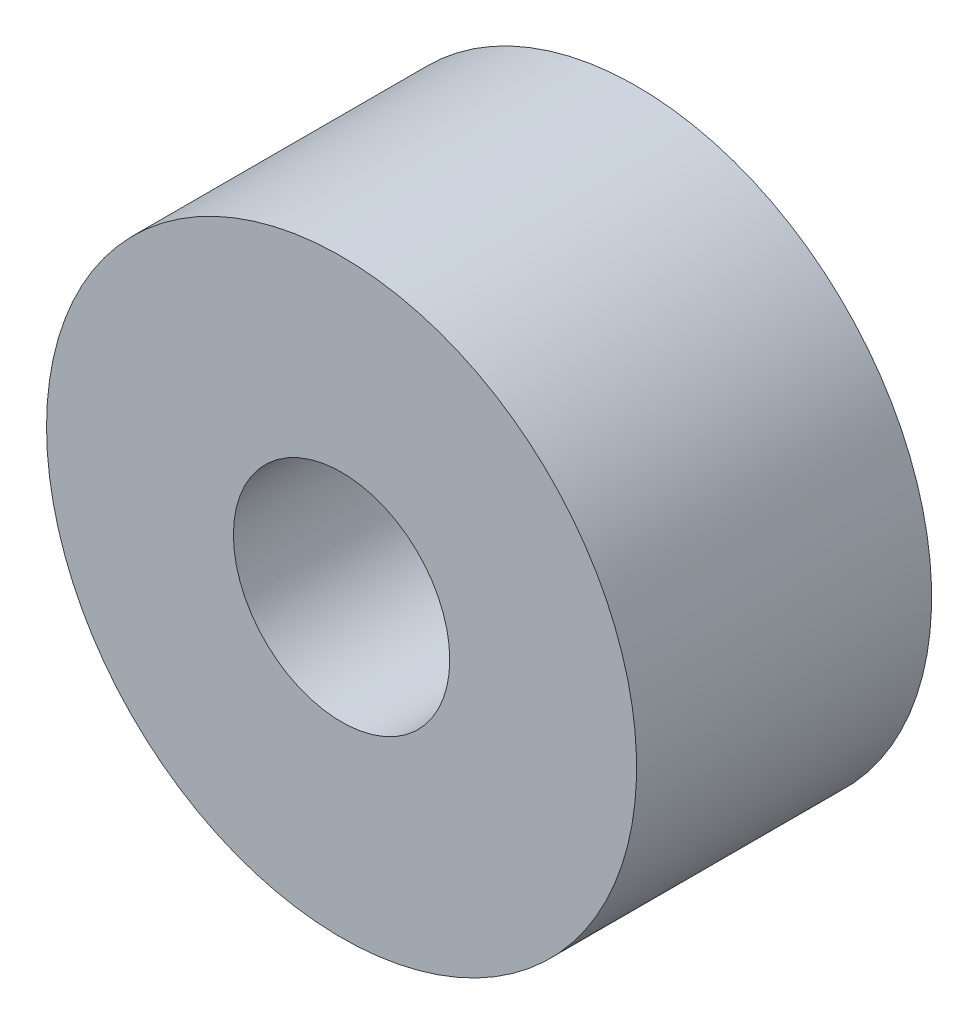
ISO-10303-21;
HEADER;
FILE_DESCRIPTION(('STEP AP214'),'2;1');
FILE_NAME('part.step','',(''),(''),'','','');
FILE_SCHEMA(('AUTOMOTIVE_DESIGN { 1 0 10303 214 1 1 1 1 }'));
ENDSEC;
DATA;
#1=APPLICATION_CONTEXT('core data for automotive mechanical design processes');
#2=APPLICATION_PROTOCOL_DEFINITION('international standard','automotive_design',2000,#1);
#3=PRODUCT_CONTEXT('',#1,'mechanical');
#4=PRODUCT('Part','Part','',(#3));
#5=PRODUCT_RELATED_PRODUCT_CATEGORY('part','',(#4));
#6=PRODUCT_DEFINITION_FORMATION('','',#4);
#7=PRODUCT_DEFINITION_CONTEXT('part definition',#1,'design');
#8=PRODUCT_DEFINITION('design','',#6,#7);
#9=PRODUCT_DEFINITION_SHAPE('','',#8);
#10=(LENGTH_UNIT() NAMED_UNIT(*) SI_UNIT(.MILLI.,.METRE.));
#11=(NAMED_UNIT(*) PLANE_ANGLE_UNIT() SI_UNIT($,.RADIAN.));
#12=(NAMED_UNIT(*) SI_UNIT($,.STERADIAN.) SOLID_ANGLE_UNIT());
#13=UNCERTAINTY_MEASURE_WITH_UNIT(LENGTH_MEASURE(1.E-05),#10,'distance_accuracy_value','');
#14=(GEOMETRIC_REPRESENTATION_CONTEXT(3) GLOBAL_UNCERTAINTY_ASSIGNED_CONTEXT((#13)) GLOBAL_UNIT_ASSIGNED_CONTEXT((#10,
#11,#12)) REPRESENTATION_CONTEXT('',''));
#15=CARTESIAN_POINT('',(0.,0.,0.));
#16=DIRECTION('',(0.,0.,1.));
#17=DIRECTION('',(1.,0.,0.));
#18=AXIS2_PLACEMENT_3D('',#15,#16,#17);
#19=CARTESIAN_POINT('',(-14.404556939476,1.05684332494996,9.525));
#20=DIRECTION('',(0.,0.,-1.));
#21=DIRECTION('',(-1.,0.,0.));
#22=AXIS2_PLACEMENT_3D('',#19,#20,#21);
#23=CYLINDRICAL_SURFACE('',#22,9.52500000000002);
#24=CARTESIAN_POINT('',(-14.404556939476,1.05684332494996,9.525));
#25=DIRECTION('',(0.,0.,1.));
#26=DIRECTION('',(1.,0.,0.));
#27=AXIS2_PLACEMENT_3D('',#24,#25,#26);
#28=CIRCLE('',#27,9.52500000000002);
#29=CARTESIAN_POINT('',(-23.929556939476,1.05684332494996,9.525));
#30=VERTEX_POINT('',#29);
#31=EDGE_CURVE('E39',#30,#30,#28,.T.);
#32=CARTESIAN_POINT('',(-14.404556939476,1.05684332494996,0.));
#33=DIRECTION('',(0.,0.,1.));
#34=DIRECTION('',(1.,0.,0.));
#35=AXIS2_PLACEMENT_3D('',#32,#33,#34);
#36=CIRCLE('',#35,9.52500000000002);
#37=CARTESIAN_POINT('',(-23.929556939476,1.05684332494996,0.));
#38=VERTEX_POINT('',#37);
#39=EDGE_CURVE('E35',#38,#38,#36,.T.);
#40=CARTESIAN_POINT('',(-23.929556939476,1.05684332494996,9.525));
#41=CARTESIAN_POINT('',(-23.929556939476,1.05684332494996,9.42578125));
#42=CARTESIAN_POINT('',(-23.929556939476,1.05684332494996,9.3265625));
#43=CARTESIAN_POINT('',(-23.929556939476,1.05684332494996,9.128125));
#44=CARTESIAN_POINT('',(-23.929556939476,1.05684332494996,9.02890625));
#45=CARTESIAN_POINT('',(-23.929556939476,1.05684332494996,8.83046875));
#46=CARTESIAN_POINT('',(-23.929556939476,1.05684332494996,8.73125));
#47=CARTESIAN_POINT('',(-23.929556939476,1.05684332494996,8.5328125));
#48=CARTESIAN_POINT('',(-23.929556939476,1.05684332494996,8.43359375));
#49=CARTESIAN_POINT('',(-23.929556939476,1.05684332494996,8.23515625));
#50=CARTESIAN_POINT('',(-23.929556939476,1.05684332494996,8.1359375));
#51=CARTESIAN_POINT('',(-23.929556939476,1.05684332494996,7.9375));
#52=CARTESIAN_POINT('',(-23.929556939476,1.05684332494996,7.83828125));
#53=CARTESIAN_POINT('',(-23.929556939476,1.05684332494996,7.63984375));
#54=CARTESIAN_POINT('',(-23.929556939476,1.05684332494996,7.540625));
#55=CARTESIAN_POINT('',(-23.929556939476,1.05684332494996,7.3421875));
#56=CARTESIAN_POINT('',(-23.929556939476,1.05684332494996,7.24296875));
#57=CARTESIAN_POINT('',(-23.929556939476,1.05684332494996,7.04453125));
#58=CARTESIAN_POINT('',(-23.929556939476,1.05684332494996,6.9453125));
#59=CARTESIAN_POINT('',(-23.929556939476,1.05684332494996,6.746875));
#60=CARTESIAN_POINT('',(-23.929556939476,1.05684332494996,6.64765625));
#61=CARTESIAN_POINT('',(-23.929556939476,1.05684332494996,6.44921875));
#62=CARTESIAN_POINT('',(-23.929556939476,1.05684332494996,6.35));
#63=CARTESIAN_POINT('',(-23.929556939476,1.05684332494996,6.1515625));
#64=CARTESIAN_POINT('',(-23.929556939476,1.05684332494996,6.05234375));
#65=CARTESIAN_POINT('',(-23.929556939476,1.05684332494996,5.85390625));
#66=CARTESIAN_POINT('',(-23.929556939476,1.05684332494996,5.7546875));
#67=CARTESIAN_POINT('',(-23.929556939476,1.05684332494996,5.55625));
#68=CARTESIAN_POINT('',(-23.929556939476,1.05684332494996,5.45703125));
#69=CARTESIAN_POINT('',(-23.929556939476,1.05684332494996,5.25859375));
#70=CARTESIAN_POINT('',(-23.929556939476,1.05684332494996,5.159375));
#71=CARTESIAN_POINT('',(-23.929556939476,1.05684332494996,4.9609375));
#72=CARTESIAN_POINT('',(-23.929556939476,1.05684332494996,4.86171875));
#73=CARTESIAN_POINT('',(-23.929556939476,1.05684332494996,4.66328125));
#74=CARTESIAN_POINT('',(-23.929556939476,1.05684332494996,4.5640625));
#75=CARTESIAN_POINT('',(-23.929556939476,1.05684332494996,4.365625));
#76=CARTESIAN_POINT('',(-23.929556939476,1.05684332494996,4.26640625));
#77=CARTESIAN_POINT('',(-23.929556939476,1.05684332494996,4.06796875));
#78=CARTESIAN_POINT('',(-23.929556939476,1.05684332494996,3.96875));
#79=CARTESIAN_POINT('',(-23.929556939476,1.05684332494996,3.7703125));
#80=CARTESIAN_POINT('',(-23.929556939476,1.05684332494996,3.67109375));
#81=CARTESIAN_POINT('',(-23.929556939476,1.05684332494996,3.47265625));
#82=CARTESIAN_POINT('',(-23.929556939476,1.05684332494996,3.3734375));
#83=CARTESIAN_POINT('',(-23.929556939476,1.05684332494996,3.175));
#84=CARTESIAN_POINT('',(-23.929556939476,1.05684332494996,3.07578125));
#85=CARTESIAN_POINT('',(-23.929556939476,1.05684332494996,2.87734375));
#86=CARTESIAN_POINT('',(-23.929556939476,1.05684332494996,2.778125));
#87=CARTESIAN_POINT('',(-23.929556939476,1.05684332494996,2.5796875));
#88=CARTESIAN_POINT('',(-23.929556939476,1.05684332494996,2.48046875));
#89=CARTESIAN_POINT('',(-23.929556939476,1.05684332494996,2.28203125));
#90=CARTESIAN_POINT('',(-23.929556939476,1.05684332494996,2.1828125));
#91=CARTESIAN_POINT('',(-23.929556939476,1.05684332494996,1.984375));
#92=CARTESIAN_POINT('',(-23.929556939476,1.05684332494996,1.88515625));
#93=CARTESIAN_POINT('',(-23.929556939476,1.05684332494996,1.68671875));
#94=CARTESIAN_POINT('',(-23.929556939476,1.05684332494996,1.5875));
#95=CARTESIAN_POINT('',(-23.929556939476,1.05684332494996,1.3890625));
#96=CARTESIAN_POINT('',(-23.929556939476,1.05684332494996,1.28984375));
#97=CARTESIAN_POINT('',(-23.929556939476,1.05684332494996,1.09140625));
#98=CARTESIAN_POINT('',(-23.929556939476,1.05684332494996,0.992187500000001));
#99=CARTESIAN_POINT('',(-23.929556939476,1.05684332494996,0.793750000000001));
#100=CARTESIAN_POINT('',(-23.929556939476,1.05684332494996,0.69453125));
#101=CARTESIAN_POINT('',(-23.929556939476,1.05684332494996,0.49609375));
#102=CARTESIAN_POINT('',(-23.929556939476,1.05684332494996,0.396875));
#103=CARTESIAN_POINT('',(-23.929556939476,1.05684332494996,0.1984375));
#104=CARTESIAN_POINT('',(-23.929556939476,1.05684332494996,0.0992187500000001));
#105=CARTESIAN_POINT('',(-23.929556939476,1.05684332494996,0.));
#106=B_SPLINE_CURVE_WITH_KNOTS('',3,(#40,#41,#42,#43,#44,#45,#46,#47,#48,#49,#50,#51,#52,#53,
#54,#55,#56,#57,#58,#59,#60,#61,#62,#63,#64,#65,#66,#67,#68,#69,#70,#71,#72,#73,#74,#75,#76,#77,
#78,#79,#80,#81,#82,#83,#84,#85,#86,#87,#88,#89,#90,#91,#92,#93,#94,#95,#96,#97,#98,#99,#100,
#101,#102,#103,#104,#105),.UNSPECIFIED.,.F.,.F.,(4,2,2,2,2,2,2,2,2,2,2,2,2,2,2,2,2,2,2,2,2,2,2,
2,2,2,2,2,2,2,2,2,4),(0.,0.29765625,0.5953125,0.892968750000001,1.190625,1.48828125,1.7859375,
2.08359375,2.38125,2.67890625,2.9765625,3.27421875,3.571875,3.86953125,4.1671875,4.46484375,
4.7625,5.06015625,5.3578125,5.65546875,5.953125,6.25078125,6.5484375,6.84609375,7.14375,
7.44140625,7.7390625,8.03671875,8.334375,8.63203125,8.9296875,9.22734375,9.525),.UNSPECIFIED.);
#107=EDGE_CURVE('BSEAM32',#30,#38,#106,.T.);
#108=ORIENTED_EDGE('',*,*,#31,.F.);
#109=ORIENTED_EDGE('',*,*,#39,.T.);
#110=ORIENTED_EDGE('',*,*,#107,.T.);
#111=ORIENTED_EDGE('',*,*,#107,.F.);
#112=EDGE_LOOP('',(#108,#110,#109,#111));
#113=FACE_BOUND('',#112,.T.);
#114=ADVANCED_FACE('F32',(#113),#23,.T.);
#115=CARTESIAN_POINT('',(-14.404556939476,1.05684332494996,9.525));
#116=DIRECTION('',(0.,0.,1.));
#117=DIRECTION('',(1.,0.,0.));
#118=AXIS2_PLACEMENT_3D('',#115,#116,#117);
#119=PLANE('',#118);
#120=CARTESIAN_POINT('',(-14.404556939476,1.05684332494996,9.525));
#121=DIRECTION('',(0.,0.,-1.));
#122=DIRECTION('',(-1.,0.,0.));
#123=AXIS2_PLACEMENT_3D('',#120,#121,#122);
#124=CIRCLE('',#123,3.4925);
#125=CARTESIAN_POINT('',(-17.897056939476,1.05684332494996,9.525));
#126=VERTEX_POINT('',#125);
#127=EDGE_CURVE('E48',#126,#126,#124,.T.);
#128=ORIENTED_EDGE('',*,*,#127,.T.);
#129=EDGE_LOOP('',(#128));
#130=FACE_BOUND('',#129,.T.);
#131=ORIENTED_EDGE('',*,*,#31,.T.);
#132=EDGE_LOOP('',(#131));
#133=FACE_BOUND('',#132,.T.);
#134=ADVANCED_FACE('F55',(#130,#133),#119,.T.);
#135=CARTESIAN_POINT('',(-14.404556939476,1.05684332494996,0.));
#136=DIRECTION('',(0.,0.,1.));
#137=DIRECTION('',(1.,0.,0.));
#138=AXIS2_PLACEMENT_3D('',#135,#136,#137);
#139=PLANE('',#138);
#140=CARTESIAN_POINT('',(-14.404556939476,1.05684332494996,0.));
#141=DIRECTION('',(0.,0.,-1.));
#142=DIRECTION('',(-1.,0.,0.));
#143=AXIS2_PLACEMENT_3D('',#140,#141,#142);
#144=CIRCLE('',#143,4.7625);
#145=CARTESIAN_POINT('',(-19.167056939476,1.05684332494996,0.));
#146=VERTEX_POINT('',#145);
#147=EDGE_CURVE('E10',#146,#146,#144,.T.);
#148=ORIENTED_EDGE('',*,*,#147,.F.);
#149=EDGE_LOOP('',(#148));
#150=FACE_BOUND('',#149,.T.);
#151=ORIENTED_EDGE('',*,*,#39,.F.);
#152=EDGE_LOOP('',(#151));
#153=FACE_BOUND('',#152,.T.);
#154=ADVANCED_FACE('F72',(#150,#153),#139,.F.);
#155=CARTESIAN_POINT('',(-14.404556939476,1.05684332494996,-3.175));
#156=DIRECTION('',(0.,0.,1.));
#157=DIRECTION('',(1.,0.,0.));
#158=AXIS2_PLACEMENT_3D('',#155,#156,#157);
#159=CYLINDRICAL_SURFACE('',#158,4.7625);
#160=CARTESIAN_POINT('',(-14.404556939476,1.05684332494996,-3.175));
#161=DIRECTION('',(0.,0.,-1.));
#162=DIRECTION('',(-1.,0.,0.));
#163=AXIS2_PLACEMENT_3D('',#160,#161,#162);
#164=CIRCLE('',#163,4.7625);
#165=CARTESIAN_POINT('',(-19.167056939476,1.05684332494996,-3.175));
#166=VERTEX_POINT('',#165);
#167=EDGE_CURVE('E45',#166,#166,#164,.T.);
#168=ORIENTED_EDGE('',*,*,#167,.F.);
#169=EDGE_LOOP('',(#168));
#170=FACE_BOUND('',#169,.T.);
#171=ORIENTED_EDGE('',*,*,#147,.T.);
#172=EDGE_LOOP('',(#171));
#173=FACE_BOUND('',#172,.T.);
#174=ADVANCED_FACE('F67',(#170,#173),#159,.T.);
#175=CARTESIAN_POINT('',(-14.404556939476,1.05684332494996,-3.175));
#176=DIRECTION('',(0.,0.,-1.));
#177=DIRECTION('',(-1.,0.,0.));
#178=AXIS2_PLACEMENT_3D('',#175,#176,#177);
#179=PLANE('',#178);
#180=CARTESIAN_POINT('',(-14.404556939476,1.05684332494996,-3.175));
#181=DIRECTION('',(0.,0.,-1.));
#182=DIRECTION('',(-1.,0.,0.));
#183=AXIS2_PLACEMENT_3D('',#180,#181,#182);
#184=CIRCLE('',#183,3.4925);
#185=CARTESIAN_POINT('',(-17.897056939476,1.05684332494996,-3.175));
#186=VERTEX_POINT('',#185);
#187=EDGE_CURVE('E49',#186,#186,#184,.T.);
#188=ORIENTED_EDGE('',*,*,#187,.F.);
#189=EDGE_LOOP('',(#188));
#190=FACE_BOUND('',#189,.T.);
#191=ORIENTED_EDGE('',*,*,#167,.T.);
#192=EDGE_LOOP('',(#191));
#193=FACE_BOUND('',#192,.T.);
#194=ADVANCED_FACE('F61',(#190,#193),#179,.T.);
#195=CARTESIAN_POINT('',(-14.404556939476,1.05684332494996,9.525));
#196=DIRECTION('',(0.,0.,-1.));
#197=DIRECTION('',(-1.,0.,0.));
#198=AXIS2_PLACEMENT_3D('',#195,#196,#197);
#199=CYLINDRICAL_SURFACE('',#198,3.4925);
#200=ORIENTED_EDGE('',*,*,#127,.F.);
#201=EDGE_LOOP('',(#200));
#202=FACE_BOUND('',#201,.T.);
#203=ORIENTED_EDGE('',*,*,#187,.T.);
#204=EDGE_LOOP('',(#203));
#205=FACE_BOUND('',#204,.T.);
#206=ADVANCED_FACE('F58',(#202,#205),#199,.F.);
#207=CLOSED_SHELL('',(#114,#134,#154,#174,#194,#206));
#208=MANIFOLD_SOLID_BREP('B2',#207);
#209=ADVANCED_BREP_SHAPE_REPRESENTATION('',(#18,#208),#14);
#210=SHAPE_DEFINITION_REPRESENTATION(#9,#209);
ENDSEC;
END-ISO-10303-21;
